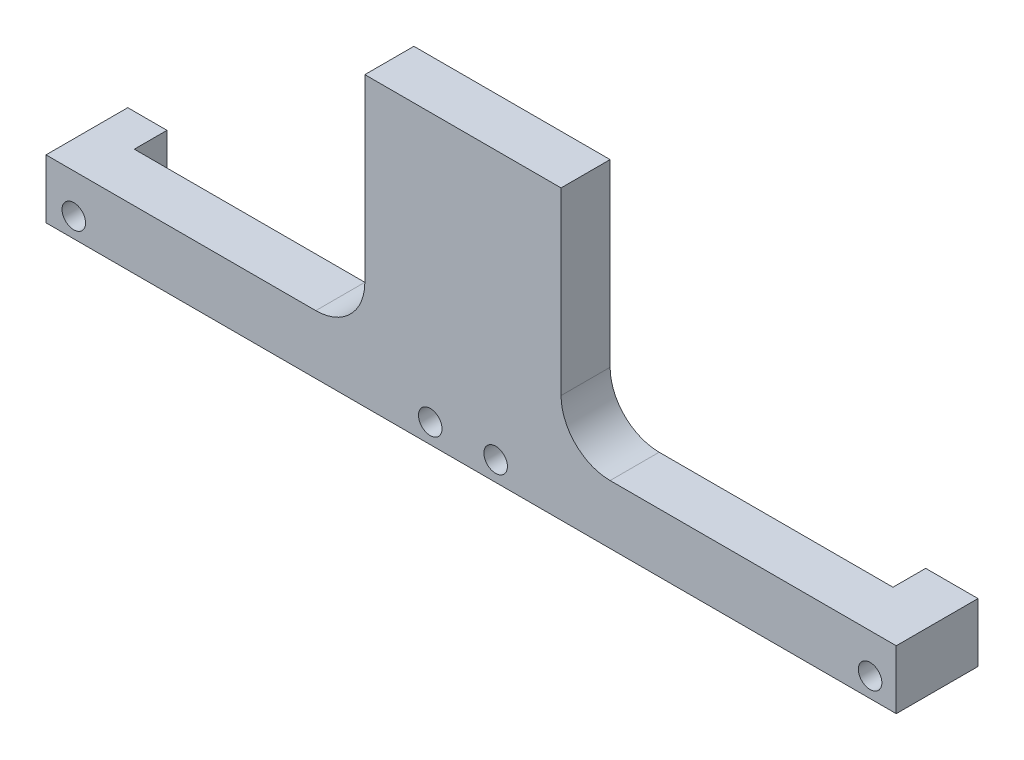
ISO-10303-21;
HEADER;
FILE_DESCRIPTION(('STEP AP214'),'2;1');
FILE_NAME('part.step','',(''),(''),'','','');
FILE_SCHEMA(('AUTOMOTIVE_DESIGN { 1 0 10303 214 1 1 1 1 }'));
ENDSEC;
DATA;
#1=APPLICATION_CONTEXT('core data for automotive mechanical design processes');
#2=APPLICATION_PROTOCOL_DEFINITION('international standard','automotive_design',2000,#1);
#3=PRODUCT_CONTEXT('',#1,'mechanical');
#4=PRODUCT('Part','Part','',(#3));
#5=PRODUCT_RELATED_PRODUCT_CATEGORY('part','',(#4));
#6=PRODUCT_DEFINITION_FORMATION('','',#4);
#7=PRODUCT_DEFINITION_CONTEXT('part definition',#1,'design');
#8=PRODUCT_DEFINITION('design','',#6,#7);
#9=PRODUCT_DEFINITION_SHAPE('','',#8);
#10=(LENGTH_UNIT() NAMED_UNIT(*) SI_UNIT(.MILLI.,.METRE.));
#11=(NAMED_UNIT(*) PLANE_ANGLE_UNIT() SI_UNIT($,.RADIAN.));
#12=(NAMED_UNIT(*) SI_UNIT($,.STERADIAN.) SOLID_ANGLE_UNIT());
#13=UNCERTAINTY_MEASURE_WITH_UNIT(LENGTH_MEASURE(1.E-05),#10,'distance_accuracy_value','');
#14=(GEOMETRIC_REPRESENTATION_CONTEXT(3) GLOBAL_UNCERTAINTY_ASSIGNED_CONTEXT((#13)) GLOBAL_UNIT_ASSIGNED_CONTEXT((#10,
#11,#12)) REPRESENTATION_CONTEXT('',''));
#15=CARTESIAN_POINT('',(0.,0.,0.));
#16=DIRECTION('',(0.,0.,1.));
#17=DIRECTION('',(1.,0.,0.));
#18=AXIS2_PLACEMENT_3D('',#15,#16,#17);
#19=CARTESIAN_POINT('',(0.,0.,0.));
#20=DIRECTION('',(0.,0.,-1.));
#21=DIRECTION('',(-1.,0.,0.));
#22=AXIS2_PLACEMENT_3D('',#19,#20,#21);
#23=PLANE('',#22);
#24=CARTESIAN_POINT('',(-125.75,3.,0.));
#25=DIRECTION('',(0.,0.,1.));
#26=DIRECTION('',(-1.,0.,0.));
#27=AXIS2_PLACEMENT_3D('',#24,#25,#26);
#28=CIRCLE('',#27,1.80000000000001);
#29=CARTESIAN_POINT('',(-124.,2.5786925113419,0.));
#30=VERTEX_POINT('',#29);
#31=CARTESIAN_POINT('',(-124.,3.42130748865815,0.));
#32=VERTEX_POINT('',#31);
#33=EDGE_CURVE('E174',#30,#32,#28,.T.);
#34=ORIENTED_EDGE('',*,*,#33,.T.);
#35=DIRECTION('',(0.,-1.,0.));
#36=VECTOR('',#35,1.);
#37=CARTESIAN_POINT('',(-124.,9.,0.));
#38=LINE('',#37,#36);
#39=CARTESIAN_POINT('',(-124.,9.,0.));
#40=VERTEX_POINT('',#39);
#41=EDGE_CURVE('E52',#40,#32,#38,.T.);
#42=ORIENTED_EDGE('',*,*,#41,.F.);
#43=DIRECTION('',(-1.,0.,0.));
#44=VECTOR('',#43,1.);
#45=CARTESIAN_POINT('',(-130.,9.,0.));
#46=LINE('',#45,#44);
#47=CARTESIAN_POINT('',(-88.75,9.,0.));
#48=VERTEX_POINT('',#47);
#49=EDGE_CURVE('E306',#48,#40,#46,.T.);
#50=ORIENTED_EDGE('',*,*,#49,.F.);
#51=CARTESIAN_POINT('',(-88.75,16.5,0.));
#52=DIRECTION('',(0.,0.,-1.));
#53=DIRECTION('',(-1.,0.,0.));
#54=AXIS2_PLACEMENT_3D('',#51,#52,#53);
#55=CIRCLE('',#54,7.5);
#56=CARTESIAN_POINT('',(-81.25,16.5,0.));
#57=VERTEX_POINT('',#56);
#58=EDGE_CURVE('E45',#48,#57,#55,.F.);
#59=ORIENTED_EDGE('',*,*,#58,.T.);
#60=DIRECTION('',(0.,-1.,0.));
#61=VECTOR('',#60,1.);
#62=CARTESIAN_POINT('',(-81.25,9.,0.));
#63=LINE('',#62,#61);
#64=CARTESIAN_POINT('',(-81.25,44.,0.));
#65=VERTEX_POINT('',#64);
#66=EDGE_CURVE('E303',#65,#57,#63,.T.);
#67=ORIENTED_EDGE('',*,*,#66,.F.);
#68=DIRECTION('',(-1.,0.,0.));
#69=VECTOR('',#68,1.);
#70=CARTESIAN_POINT('',(-81.25,44.,0.));
#71=LINE('',#70,#69);
#72=CARTESIAN_POINT('',(-51.25,44.,0.));
#73=VERTEX_POINT('',#72);
#74=EDGE_CURVE('E301',#73,#65,#71,.T.);
#75=ORIENTED_EDGE('',*,*,#74,.F.);
#76=DIRECTION('',(0.,1.,0.));
#77=VECTOR('',#76,1.);
#78=CARTESIAN_POINT('',(-51.25,44.,0.));
#79=LINE('',#78,#77);
#80=CARTESIAN_POINT('',(-51.25,16.5,0.));
#81=VERTEX_POINT('',#80);
#82=EDGE_CURVE('E299',#81,#73,#79,.T.);
#83=ORIENTED_EDGE('',*,*,#82,.F.);
#84=CARTESIAN_POINT('',(-43.75,16.5,0.));
#85=DIRECTION('',(0.,0.,-1.));
#86=DIRECTION('',(-1.,0.,0.));
#87=AXIS2_PLACEMENT_3D('',#84,#85,#86);
#88=CIRCLE('',#87,7.5);
#89=CARTESIAN_POINT('',(-43.75,8.99999999999999,0.));
#90=VERTEX_POINT('',#89);
#91=EDGE_CURVE('E333',#81,#90,#88,.F.);
#92=ORIENTED_EDGE('',*,*,#91,.T.);
#93=DIRECTION('',(-1.,0.,0.));
#94=VECTOR('',#93,1.);
#95=CARTESIAN_POINT('',(-51.25,8.99999999999999,0.));
#96=LINE('',#95,#94);
#97=CARTESIAN_POINT('',(-8.,8.99999999999999,0.));
#98=VERTEX_POINT('',#97);
#99=EDGE_CURVE('E277',#98,#90,#96,.T.);
#100=ORIENTED_EDGE('',*,*,#99,.F.);
#101=DIRECTION('',(0.,1.,0.));
#102=VECTOR('',#101,1.);
#103=CARTESIAN_POINT('',(-8.,0.,0.));
#104=LINE('',#103,#102);
#105=CARTESIAN_POINT('',(-8.,0.,0.));
#106=VERTEX_POINT('',#105);
#107=EDGE_CURVE('E249',#106,#98,#104,.T.);
#108=ORIENTED_EDGE('',*,*,#107,.F.);
#109=DIRECTION('',(1.,0.,0.));
#110=VECTOR('',#109,1.);
#111=CARTESIAN_POINT('',(0.,0.,0.));
#112=LINE('',#111,#110);
#113=CARTESIAN_POINT('',(-56.25,0.,0.));
#114=VERTEX_POINT('',#113);
#115=EDGE_CURVE('E308',#114,#106,#112,.T.);
#116=ORIENTED_EDGE('',*,*,#115,.F.);
#117=DIRECTION('',(0.,-1.,0.));
#118=VECTOR('',#117,1.);
#119=CARTESIAN_POINT('',(-56.25,0.,0.));
#120=LINE('',#119,#118);
#121=CARTESIAN_POINT('',(-56.25,6.,0.));
#122=VERTEX_POINT('',#121);
#123=EDGE_CURVE('E231',#122,#114,#120,.T.);
#124=ORIENTED_EDGE('',*,*,#123,.F.);
#125=DIRECTION('',(1.,0.,0.));
#126=VECTOR('',#125,1.);
#127=CARTESIAN_POINT('',(-56.25,6.,0.));
#128=LINE('',#127,#126);
#129=CARTESIAN_POINT('',(-76.25,6.,0.));
#130=VERTEX_POINT('',#129);
#131=EDGE_CURVE('E226',#130,#122,#128,.T.);
#132=ORIENTED_EDGE('',*,*,#131,.F.);
#133=DIRECTION('',(0.,1.,0.));
#134=VECTOR('',#133,1.);
#135=CARTESIAN_POINT('',(-76.25,0.,0.));
#136=LINE('',#135,#134);
#137=CARTESIAN_POINT('',(-76.25,0.,0.));
#138=VERTEX_POINT('',#137);
#139=EDGE_CURVE('E228',#138,#130,#136,.T.);
#140=ORIENTED_EDGE('',*,*,#139,.F.);
#141=CARTESIAN_POINT('',(-124.,0.,0.));
#142=VERTEX_POINT('',#141);
#143=EDGE_CURVE('E59',#142,#138,#112,.T.);
#144=ORIENTED_EDGE('',*,*,#143,.F.);
#145=DIRECTION('',(0.,-1.,0.));
#146=VECTOR('',#145,1.);
#147=CARTESIAN_POINT('',(-124.,0.,0.));
#148=LINE('',#147,#146);
#149=EDGE_CURVE('E185',#30,#142,#148,.T.);
#150=ORIENTED_EDGE('',*,*,#149,.F.);
#151=EDGE_LOOP('',(#34,#42,#50,#59,#67,#75,#83,#92,#100,#108,#116,#124,#132,#140,#144,#150));
#152=FACE_BOUND('',#151,.T.);
#153=ADVANCED_FACE('F37',(#152),#23,.T.);
#154=CARTESIAN_POINT('',(0.,0.,7.5));
#155=DIRECTION('',(0.,0.,-1.));
#156=DIRECTION('',(-1.,0.,0.));
#157=AXIS2_PLACEMENT_3D('',#154,#155,#156);
#158=PLANE('',#157);
#159=DIRECTION('',(-1.,0.,0.));
#160=VECTOR('',#159,1.);
#161=CARTESIAN_POINT('',(-51.25,8.99999999999999,7.5));
#162=LINE('',#161,#160);
#163=CARTESIAN_POINT('',(0.,8.99999999999999,7.5));
#164=VERTEX_POINT('',#163);
#165=CARTESIAN_POINT('',(-43.75,8.99999999999999,7.5));
#166=VERTEX_POINT('',#165);
#167=EDGE_CURVE('E279',#164,#166,#162,.T.);
#168=ORIENTED_EDGE('',*,*,#167,.T.);
#169=CARTESIAN_POINT('',(-43.75,16.5,7.5));
#170=DIRECTION('',(0.,0.,-1.));
#171=DIRECTION('',(-1.,0.,0.));
#172=AXIS2_PLACEMENT_3D('',#169,#170,#171);
#173=CIRCLE('',#172,7.5);
#174=CARTESIAN_POINT('',(-51.25,16.5,7.5));
#175=VERTEX_POINT('',#174);
#176=EDGE_CURVE('E336',#166,#175,#173,.T.);
#177=ORIENTED_EDGE('',*,*,#176,.T.);
#178=DIRECTION('',(0.,1.,0.));
#179=VECTOR('',#178,1.);
#180=CARTESIAN_POINT('',(-51.25,44.,7.5));
#181=LINE('',#180,#179);
#182=CARTESIAN_POINT('',(-51.25,44.,7.5));
#183=VERTEX_POINT('',#182);
#184=EDGE_CURVE('E282',#175,#183,#181,.T.);
#185=ORIENTED_EDGE('',*,*,#184,.T.);
#186=DIRECTION('',(-1.,0.,0.));
#187=VECTOR('',#186,1.);
#188=CARTESIAN_POINT('',(-81.25,44.,7.5));
#189=LINE('',#188,#187);
#190=CARTESIAN_POINT('',(-81.25,44.,7.5));
#191=VERTEX_POINT('',#190);
#192=EDGE_CURVE('E284',#183,#191,#189,.T.);
#193=ORIENTED_EDGE('',*,*,#192,.T.);
#194=DIRECTION('',(0.,-1.,0.));
#195=VECTOR('',#194,1.);
#196=CARTESIAN_POINT('',(-81.25,9.,7.5));
#197=LINE('',#196,#195);
#198=CARTESIAN_POINT('',(-81.25,16.5,7.5));
#199=VERTEX_POINT('',#198);
#200=EDGE_CURVE('E286',#191,#199,#197,.T.);
#201=ORIENTED_EDGE('',*,*,#200,.T.);
#202=CARTESIAN_POINT('',(-88.75,16.5,7.5));
#203=DIRECTION('',(0.,0.,-1.));
#204=DIRECTION('',(-1.,0.,0.));
#205=AXIS2_PLACEMENT_3D('',#202,#203,#204);
#206=CIRCLE('',#205,7.5);
#207=CARTESIAN_POINT('',(-88.75,9.,7.5));
#208=VERTEX_POINT('',#207);
#209=EDGE_CURVE('E11',#199,#208,#206,.T.);
#210=ORIENTED_EDGE('',*,*,#209,.T.);
#211=DIRECTION('',(-1.,0.,0.));
#212=VECTOR('',#211,1.);
#213=CARTESIAN_POINT('',(-130.,9.,7.5));
#214=LINE('',#213,#212);
#215=CARTESIAN_POINT('',(-130.,9.,7.5));
#216=VERTEX_POINT('',#215);
#217=EDGE_CURVE('E289',#208,#216,#214,.T.);
#218=ORIENTED_EDGE('',*,*,#217,.T.);
#219=DIRECTION('',(0.,-1.,0.));
#220=VECTOR('',#219,1.);
#221=CARTESIAN_POINT('',(-130.,0.,7.5));
#222=LINE('',#221,#220);
#223=CARTESIAN_POINT('',(-130.,0.,7.5));
#224=VERTEX_POINT('',#223);
#225=EDGE_CURVE('E291',#216,#224,#222,.T.);
#226=ORIENTED_EDGE('',*,*,#225,.T.);
#227=DIRECTION('',(1.,0.,0.));
#228=VECTOR('',#227,1.);
#229=CARTESIAN_POINT('',(0.,0.,7.5));
#230=LINE('',#229,#228);
#231=CARTESIAN_POINT('',(0.,0.,7.5));
#232=VERTEX_POINT('',#231);
#233=EDGE_CURVE('E293',#224,#232,#230,.T.);
#234=ORIENTED_EDGE('',*,*,#233,.T.);
#235=DIRECTION('',(0.,1.,0.));
#236=VECTOR('',#235,1.);
#237=CARTESIAN_POINT('',(0.,8.99999999999999,7.5));
#238=LINE('',#237,#236);
#239=EDGE_CURVE('E295',#232,#164,#238,.T.);
#240=ORIENTED_EDGE('',*,*,#239,.T.);
#241=EDGE_LOOP('',(#168,#177,#185,#193,#201,#210,#218,#226,#234,#240));
#242=FACE_BOUND('',#241,.T.);
#243=CARTESIAN_POINT('',(-125.75,3.,7.5));
#244=DIRECTION('',(0.,0.,1.));
#245=DIRECTION('',(-1.,0.,0.));
#246=AXIS2_PLACEMENT_3D('',#243,#244,#245);
#247=CIRCLE('',#246,1.80000000000001);
#248=CARTESIAN_POINT('',(-127.55,3.,7.5));
#249=VERTEX_POINT('',#248);
#250=EDGE_CURVE('E182',#249,#249,#247,.T.);
#251=ORIENTED_EDGE('',*,*,#250,.F.);
#252=EDGE_LOOP('',(#251));
#253=FACE_BOUND('',#252,.T.);
#254=CARTESIAN_POINT('',(-71.25,3.,7.5));
#255=DIRECTION('',(0.,0.,1.));
#256=DIRECTION('',(-1.,0.,0.));
#257=AXIS2_PLACEMENT_3D('',#254,#255,#256);
#258=CIRCLE('',#257,1.79999999999999);
#259=CARTESIAN_POINT('',(-73.05,3.,7.5));
#260=VERTEX_POINT('',#259);
#261=EDGE_CURVE('E183',#260,#260,#258,.T.);
#262=ORIENTED_EDGE('',*,*,#261,.F.);
#263=EDGE_LOOP('',(#262));
#264=FACE_BOUND('',#263,.T.);
#265=CARTESIAN_POINT('',(-61.25,3.,7.5));
#266=DIRECTION('',(0.,0.,1.));
#267=DIRECTION('',(-1.,0.,0.));
#268=AXIS2_PLACEMENT_3D('',#265,#266,#267);
#269=CIRCLE('',#268,1.79999999999999);
#270=CARTESIAN_POINT('',(-63.05,3.,7.5));
#271=VERTEX_POINT('',#270);
#272=EDGE_CURVE('E271',#271,#271,#269,.T.);
#273=ORIENTED_EDGE('',*,*,#272,.F.);
#274=EDGE_LOOP('',(#273));
#275=FACE_BOUND('',#274,.T.);
#276=CARTESIAN_POINT('',(-4.,3.,7.5));
#277=DIRECTION('',(0.,0.,1.));
#278=DIRECTION('',(-1.,0.,0.));
#279=AXIS2_PLACEMENT_3D('',#276,#277,#278);
#280=CIRCLE('',#279,1.8);
#281=CARTESIAN_POINT('',(-5.8,3.,7.5));
#282=VERTEX_POINT('',#281);
#283=EDGE_CURVE('E268',#282,#282,#280,.T.);
#284=ORIENTED_EDGE('',*,*,#283,.F.);
#285=EDGE_LOOP('',(#284));
#286=FACE_BOUND('',#285,.T.);
#287=ADVANCED_FACE('F349',(#242,#253,#264,#275,#286),#158,.F.);
#288=CARTESIAN_POINT('',(-51.25,8.99999999999999,7.5));
#289=DIRECTION('',(0.,-1.,0.));
#290=DIRECTION('',(0.,0.,-1.));
#291=AXIS2_PLACEMENT_3D('',#288,#289,#290);
#292=PLANE('',#291);
#293=DIRECTION('',(0.,0.,-1.));
#294=VECTOR('',#293,1.);
#295=CARTESIAN_POINT('',(0.,8.99999999999999,7.5));
#296=LINE('',#295,#294);
#297=CARTESIAN_POINT('',(0.,8.99999999999999,-5.));
#298=VERTEX_POINT('',#297);
#299=EDGE_CURVE('E297',#164,#298,#296,.T.);
#300=ORIENTED_EDGE('',*,*,#299,.T.);
#301=DIRECTION('',(1.,0.,0.));
#302=VECTOR('',#301,1.);
#303=CARTESIAN_POINT('',(0.,8.99999999999999,-5.));
#304=LINE('',#303,#302);
#305=CARTESIAN_POINT('',(-8.,8.99999999999999,-5.));
#306=VERTEX_POINT('',#305);
#307=EDGE_CURVE('E257',#306,#298,#304,.T.);
#308=ORIENTED_EDGE('',*,*,#307,.F.);
#309=DIRECTION('',(0.,0.,1.));
#310=VECTOR('',#309,1.);
#311=CARTESIAN_POINT('',(-8.,8.99999999999999,-5.));
#312=LINE('',#311,#310);
#313=EDGE_CURVE('E260',#306,#98,#312,.T.);
#314=ORIENTED_EDGE('',*,*,#313,.T.);
#315=ORIENTED_EDGE('',*,*,#99,.T.);
#316=DIRECTION('',(0.,0.,-1.));
#317=VECTOR('',#316,1.);
#318=CARTESIAN_POINT('',(-43.75,8.99999999999999,7.5));
#319=LINE('',#318,#317);
#320=EDGE_CURVE('E326',#90,#166,#319,.F.);
#321=ORIENTED_EDGE('',*,*,#320,.T.);
#322=ORIENTED_EDGE('',*,*,#167,.F.);
#323=EDGE_LOOP('',(#300,#308,#314,#315,#321,#322));
#324=FACE_BOUND('',#323,.T.);
#325=ADVANCED_FACE('F375',(#324),#292,.F.);
#326=CARTESIAN_POINT('',(-51.25,44.,7.5));
#327=DIRECTION('',(-1.,0.,0.));
#328=DIRECTION('',(0.,0.,1.));
#329=AXIS2_PLACEMENT_3D('',#326,#327,#328);
#330=PLANE('',#329);
#331=ORIENTED_EDGE('',*,*,#184,.F.);
#332=DIRECTION('',(0.,0.,-1.));
#333=VECTOR('',#332,1.);
#334=CARTESIAN_POINT('',(-51.25,16.5,0.));
#335=LINE('',#334,#333);
#336=EDGE_CURVE('E323',#175,#81,#335,.T.);
#337=ORIENTED_EDGE('',*,*,#336,.T.);
#338=ORIENTED_EDGE('',*,*,#82,.T.);
#339=DIRECTION('',(0.,0.,-1.));
#340=VECTOR('',#339,1.);
#341=CARTESIAN_POINT('',(-51.25,44.,7.5));
#342=LINE('',#341,#340);
#343=EDGE_CURVE('E320',#183,#73,#342,.T.);
#344=ORIENTED_EDGE('',*,*,#343,.F.);
#345=EDGE_LOOP('',(#331,#337,#338,#344));
#346=FACE_BOUND('',#345,.T.);
#347=ADVANCED_FACE('F384',(#346),#330,.F.);
#348=CARTESIAN_POINT('',(-81.25,44.,7.5));
#349=DIRECTION('',(0.,-1.,0.));
#350=DIRECTION('',(0.,0.,-1.));
#351=AXIS2_PLACEMENT_3D('',#348,#349,#350);
#352=PLANE('',#351);
#353=ORIENTED_EDGE('',*,*,#74,.T.);
#354=DIRECTION('',(0.,0.,-1.));
#355=VECTOR('',#354,1.);
#356=CARTESIAN_POINT('',(-81.25,44.,7.5));
#357=LINE('',#356,#355);
#358=EDGE_CURVE('E317',#191,#65,#357,.T.);
#359=ORIENTED_EDGE('',*,*,#358,.F.);
#360=ORIENTED_EDGE('',*,*,#192,.F.);
#361=ORIENTED_EDGE('',*,*,#343,.T.);
#362=EDGE_LOOP('',(#353,#359,#360,#361));
#363=FACE_BOUND('',#362,.T.);
#364=ADVANCED_FACE('F387',(#363),#352,.F.);
#365=CARTESIAN_POINT('',(-81.25,9.,7.5));
#366=DIRECTION('',(1.,0.,0.));
#367=DIRECTION('',(0.,0.,-1.));
#368=AXIS2_PLACEMENT_3D('',#365,#366,#367);
#369=PLANE('',#368);
#370=ORIENTED_EDGE('',*,*,#66,.T.);
#371=DIRECTION('',(0.,0.,-1.));
#372=VECTOR('',#371,1.);
#373=CARTESIAN_POINT('',(-81.25,16.5,7.5));
#374=LINE('',#373,#372);
#375=EDGE_CURVE('E331',#57,#199,#374,.F.);
#376=ORIENTED_EDGE('',*,*,#375,.T.);
#377=ORIENTED_EDGE('',*,*,#200,.F.);
#378=ORIENTED_EDGE('',*,*,#358,.T.);
#379=EDGE_LOOP('',(#370,#376,#377,#378));
#380=FACE_BOUND('',#379,.T.);
#381=ADVANCED_FACE('F343',(#380),#369,.F.);
#382=CARTESIAN_POINT('',(-130.,9.,7.5));
#383=DIRECTION('',(0.,-1.,0.));
#384=DIRECTION('',(0.,0.,-1.));
#385=AXIS2_PLACEMENT_3D('',#382,#383,#384);
#386=PLANE('',#385);
#387=ORIENTED_EDGE('',*,*,#217,.F.);
#388=DIRECTION('',(0.,0.,-1.));
#389=VECTOR('',#388,1.);
#390=CARTESIAN_POINT('',(-88.75,9.,0.));
#391=LINE('',#390,#389);
#392=EDGE_CURVE('E328',#208,#48,#391,.T.);
#393=ORIENTED_EDGE('',*,*,#392,.T.);
#394=ORIENTED_EDGE('',*,*,#49,.T.);
#395=DIRECTION('',(0.,0.,1.));
#396=VECTOR('',#395,1.);
#397=CARTESIAN_POINT('',(-124.,9.,-5.));
#398=LINE('',#397,#396);
#399=CARTESIAN_POINT('',(-124.,9.,-5.));
#400=VERTEX_POINT('',#399);
#401=EDGE_CURVE('E197',#400,#40,#398,.T.);
#402=ORIENTED_EDGE('',*,*,#401,.F.);
#403=DIRECTION('',(1.,0.,0.));
#404=VECTOR('',#403,1.);
#405=CARTESIAN_POINT('',(-130.,9.,-5.));
#406=LINE('',#405,#404);
#407=CARTESIAN_POINT('',(-130.,9.,-5.));
#408=VERTEX_POINT('',#407);
#409=EDGE_CURVE('E210',#408,#400,#406,.T.);
#410=ORIENTED_EDGE('',*,*,#409,.F.);
#411=DIRECTION('',(0.,0.,-1.));
#412=VECTOR('',#411,1.);
#413=CARTESIAN_POINT('',(-130.,9.,7.5));
#414=LINE('',#413,#412);
#415=EDGE_CURVE('E315',#216,#408,#414,.T.);
#416=ORIENTED_EDGE('',*,*,#415,.F.);
#417=EDGE_LOOP('',(#387,#393,#394,#402,#410,#416));
#418=FACE_BOUND('',#417,.T.);
#419=ADVANCED_FACE('F353',(#418),#386,.F.);
#420=CARTESIAN_POINT('',(-130.,0.,7.5));
#421=DIRECTION('',(1.,0.,0.));
#422=DIRECTION('',(0.,0.,-1.));
#423=AXIS2_PLACEMENT_3D('',#420,#421,#422);
#424=PLANE('',#423);
#425=ORIENTED_EDGE('',*,*,#415,.T.);
#426=DIRECTION('',(0.,1.,0.));
#427=VECTOR('',#426,1.);
#428=CARTESIAN_POINT('',(-130.,0.,-5.));
#429=LINE('',#428,#427);
#430=CARTESIAN_POINT('',(-130.,0.,-5.));
#431=VERTEX_POINT('',#430);
#432=EDGE_CURVE('E189',#431,#408,#429,.T.);
#433=ORIENTED_EDGE('',*,*,#432,.F.);
#434=DIRECTION('',(0.,0.,-1.));
#435=VECTOR('',#434,1.);
#436=CARTESIAN_POINT('',(-130.,0.,7.5));
#437=LINE('',#436,#435);
#438=EDGE_CURVE('E313',#224,#431,#437,.T.);
#439=ORIENTED_EDGE('',*,*,#438,.F.);
#440=ORIENTED_EDGE('',*,*,#225,.F.);
#441=EDGE_LOOP('',(#425,#433,#439,#440));
#442=FACE_BOUND('',#441,.T.);
#443=ADVANCED_FACE('F360',(#442),#424,.F.);
#444=CARTESIAN_POINT('',(0.,0.,7.5));
#445=DIRECTION('',(0.,1.,0.));
#446=DIRECTION('',(0.,0.,1.));
#447=AXIS2_PLACEMENT_3D('',#444,#445,#446);
#448=PLANE('',#447);
#449=ORIENTED_EDGE('',*,*,#438,.T.);
#450=DIRECTION('',(-1.,0.,0.));
#451=VECTOR('',#450,1.);
#452=CARTESIAN_POINT('',(-130.,0.,-5.));
#453=LINE('',#452,#451);
#454=CARTESIAN_POINT('',(-124.,0.,-5.));
#455=VERTEX_POINT('',#454);
#456=EDGE_CURVE('E195',#455,#431,#453,.T.);
#457=ORIENTED_EDGE('',*,*,#456,.F.);
#458=DIRECTION('',(0.,0.,1.));
#459=VECTOR('',#458,1.);
#460=CARTESIAN_POINT('',(-124.,0.,-5.));
#461=LINE('',#460,#459);
#462=EDGE_CURVE('E193',#455,#142,#461,.T.);
#463=ORIENTED_EDGE('',*,*,#462,.T.);
#464=ORIENTED_EDGE('',*,*,#143,.T.);
#465=DIRECTION('',(0.,0.,1.));
#466=VECTOR('',#465,1.);
#467=CARTESIAN_POINT('',(-76.25,0.,-5.));
#468=LINE('',#467,#466);
#469=CARTESIAN_POINT('',(-76.25,0.,-5.));
#470=VERTEX_POINT('',#469);
#471=EDGE_CURVE('E216',#470,#138,#468,.T.);
#472=ORIENTED_EDGE('',*,*,#471,.F.);
#473=DIRECTION('',(-1.,0.,0.));
#474=VECTOR('',#473,1.);
#475=CARTESIAN_POINT('',(-56.25,0.,-5.));
#476=LINE('',#475,#474);
#477=CARTESIAN_POINT('',(-56.25,0.,-5.));
#478=VERTEX_POINT('',#477);
#479=EDGE_CURVE('E237',#478,#470,#476,.T.);
#480=ORIENTED_EDGE('',*,*,#479,.F.);
#481=DIRECTION('',(0.,0.,1.));
#482=VECTOR('',#481,1.);
#483=CARTESIAN_POINT('',(-56.25,0.,-5.));
#484=LINE('',#483,#482);
#485=EDGE_CURVE('E202',#478,#114,#484,.T.);
#486=ORIENTED_EDGE('',*,*,#485,.T.);
#487=ORIENTED_EDGE('',*,*,#115,.T.);
#488=DIRECTION('',(0.,0.,1.));
#489=VECTOR('',#488,1.);
#490=CARTESIAN_POINT('',(-8.,0.,-5.));
#491=LINE('',#490,#489);
#492=CARTESIAN_POINT('',(-8.,0.,-5.));
#493=VERTEX_POINT('',#492);
#494=EDGE_CURVE('E265',#493,#106,#491,.T.);
#495=ORIENTED_EDGE('',*,*,#494,.F.);
#496=DIRECTION('',(-1.,0.,0.));
#497=VECTOR('',#496,1.);
#498=CARTESIAN_POINT('',(0.,0.,-5.));
#499=LINE('',#498,#497);
#500=CARTESIAN_POINT('',(0.,0.,-5.));
#501=VERTEX_POINT('',#500);
#502=EDGE_CURVE('E253',#501,#493,#499,.T.);
#503=ORIENTED_EDGE('',*,*,#502,.F.);
#504=DIRECTION('',(0.,0.,-1.));
#505=VECTOR('',#504,1.);
#506=CARTESIAN_POINT('',(0.,0.,7.5));
#507=LINE('',#506,#505);
#508=EDGE_CURVE('E311',#232,#501,#507,.T.);
#509=ORIENTED_EDGE('',*,*,#508,.F.);
#510=ORIENTED_EDGE('',*,*,#233,.F.);
#511=EDGE_LOOP('',(#449,#457,#463,#464,#472,#480,#486,#487,#495,#503,#509,#510));
#512=FACE_BOUND('',#511,.T.);
#513=ADVANCED_FACE('F367',(#512),#448,.F.);
#514=CARTESIAN_POINT('',(0.,8.99999999999999,7.5));
#515=DIRECTION('',(-1.,0.,0.));
#516=DIRECTION('',(0.,0.,1.));
#517=AXIS2_PLACEMENT_3D('',#514,#515,#516);
#518=PLANE('',#517);
#519=ORIENTED_EDGE('',*,*,#508,.T.);
#520=DIRECTION('',(0.,-1.,0.));
#521=VECTOR('',#520,1.);
#522=CARTESIAN_POINT('',(0.,0.,-5.));
#523=LINE('',#522,#521);
#524=EDGE_CURVE('E250',#298,#501,#523,.T.);
#525=ORIENTED_EDGE('',*,*,#524,.F.);
#526=ORIENTED_EDGE('',*,*,#299,.F.);
#527=ORIENTED_EDGE('',*,*,#239,.F.);
#528=EDGE_LOOP('',(#519,#525,#526,#527));
#529=FACE_BOUND('',#528,.T.);
#530=ADVANCED_FACE('F371',(#529),#518,.F.);
#531=CARTESIAN_POINT('',(-125.75,3.,7.5));
#532=DIRECTION('',(0.,0.,-1.));
#533=DIRECTION('',(-1.,0.,0.));
#534=AXIS2_PLACEMENT_3D('',#531,#532,#533);
#535=CYLINDRICAL_SURFACE('',#534,1.80000000000001);
#536=ORIENTED_EDGE('',*,*,#250,.T.);
#537=EDGE_LOOP('',(#536));
#538=FACE_BOUND('',#537,.T.);
#539=ORIENTED_EDGE('',*,*,#33,.F.);
#540=DIRECTION('',(0.,0.,1.));
#541=VECTOR('',#540,1.);
#542=CARTESIAN_POINT('',(-124.,2.5786925113419,-5.));
#543=LINE('',#542,#541);
#544=CARTESIAN_POINT('',(-124.,2.5786925113419,-5.));
#545=VERTEX_POINT('',#544);
#546=EDGE_CURVE('E178',#545,#30,#543,.T.);
#547=ORIENTED_EDGE('',*,*,#546,.F.);
#548=CARTESIAN_POINT('',(-125.75,3.,-5.));
#549=DIRECTION('',(0.,0.,1.));
#550=DIRECTION('',(-1.,0.,0.));
#551=AXIS2_PLACEMENT_3D('',#548,#549,#550);
#552=CIRCLE('',#551,1.8);
#553=CARTESIAN_POINT('',(-124.,3.42130748865814,-5.));
#554=VERTEX_POINT('',#553);
#555=EDGE_CURVE('E206',#554,#545,#552,.T.);
#556=ORIENTED_EDGE('',*,*,#555,.F.);
#557=DIRECTION('',(0.,0.,1.));
#558=VECTOR('',#557,1.);
#559=CARTESIAN_POINT('',(-124.,3.42130748865814,-5.));
#560=LINE('',#559,#558);
#561=EDGE_CURVE('E181',#554,#32,#560,.T.);
#562=ORIENTED_EDGE('',*,*,#561,.T.);
#563=EDGE_LOOP('',(#539,#547,#556,#562));
#564=FACE_BOUND('',#563,.T.);
#565=ADVANCED_FACE('F175',(#538,#564),#535,.F.);
#566=CARTESIAN_POINT('',(-71.25,3.,7.5));
#567=DIRECTION('',(0.,0.,-1.));
#568=DIRECTION('',(-1.,0.,0.));
#569=AXIS2_PLACEMENT_3D('',#566,#567,#568);
#570=CYLINDRICAL_SURFACE('',#569,1.79999999999999);
#571=ORIENTED_EDGE('',*,*,#261,.T.);
#572=EDGE_LOOP('',(#571));
#573=FACE_BOUND('',#572,.T.);
#574=CARTESIAN_POINT('',(-71.25,3.,-5.));
#575=DIRECTION('',(0.,0.,-1.));
#576=DIRECTION('',(-1.,0.,0.));
#577=AXIS2_PLACEMENT_3D('',#574,#575,#576);
#578=CIRCLE('',#577,1.79999999999999);
#579=CARTESIAN_POINT('',(-73.05,3.,-5.));
#580=VERTEX_POINT('',#579);
#581=EDGE_CURVE('E243',#580,#580,#578,.T.);
#582=ORIENTED_EDGE('',*,*,#581,.T.);
#583=EDGE_LOOP('',(#582));
#584=FACE_BOUND('',#583,.T.);
#585=ADVANCED_FACE('F435',(#573,#584),#570,.F.);
#586=CARTESIAN_POINT('',(-61.25,3.,7.5));
#587=DIRECTION('',(0.,0.,-1.));
#588=DIRECTION('',(-1.,0.,0.));
#589=AXIS2_PLACEMENT_3D('',#586,#587,#588);
#590=CYLINDRICAL_SURFACE('',#589,1.79999999999999);
#591=ORIENTED_EDGE('',*,*,#272,.T.);
#592=EDGE_LOOP('',(#591));
#593=FACE_BOUND('',#592,.T.);
#594=CARTESIAN_POINT('',(-61.25,3.,-5.));
#595=DIRECTION('',(0.,0.,-1.));
#596=DIRECTION('',(-1.,0.,0.));
#597=AXIS2_PLACEMENT_3D('',#594,#595,#596);
#598=CIRCLE('',#597,1.79999999999999);
#599=CARTESIAN_POINT('',(-63.05,3.,-5.));
#600=VERTEX_POINT('',#599);
#601=EDGE_CURVE('E233',#600,#600,#598,.T.);
#602=ORIENTED_EDGE('',*,*,#601,.T.);
#603=EDGE_LOOP('',(#602));
#604=FACE_BOUND('',#603,.T.);
#605=ADVANCED_FACE('F442',(#593,#604),#590,.F.);
#606=CARTESIAN_POINT('',(-4.,3.,7.5));
#607=DIRECTION('',(0.,0.,-1.));
#608=DIRECTION('',(-1.,0.,0.));
#609=AXIS2_PLACEMENT_3D('',#606,#607,#608);
#610=CYLINDRICAL_SURFACE('',#609,1.8);
#611=ORIENTED_EDGE('',*,*,#283,.T.);
#612=EDGE_LOOP('',(#611));
#613=FACE_BOUND('',#612,.T.);
#614=CARTESIAN_POINT('',(-4.,3.,-5.));
#615=DIRECTION('',(0.,0.,-1.));
#616=DIRECTION('',(-1.,0.,0.));
#617=AXIS2_PLACEMENT_3D('',#614,#615,#616);
#618=CIRCLE('',#617,1.8);
#619=CARTESIAN_POINT('',(-5.8,3.,-5.));
#620=VERTEX_POINT('',#619);
#621=EDGE_CURVE('E246',#620,#620,#618,.T.);
#622=ORIENTED_EDGE('',*,*,#621,.T.);
#623=EDGE_LOOP('',(#622));
#624=FACE_BOUND('',#623,.T.);
#625=ADVANCED_FACE('F450',(#613,#624),#610,.F.);
#626=CARTESIAN_POINT('',(-43.75,16.5,7.5));
#627=DIRECTION('',(0.,0.,1.));
#628=DIRECTION('',(1.,0.,0.));
#629=AXIS2_PLACEMENT_3D('',#626,#627,#628);
#630=CYLINDRICAL_SURFACE('',#629,7.5);
#631=ORIENTED_EDGE('',*,*,#176,.F.);
#632=ORIENTED_EDGE('',*,*,#320,.F.);
#633=ORIENTED_EDGE('',*,*,#91,.F.);
#634=ORIENTED_EDGE('',*,*,#336,.F.);
#635=EDGE_LOOP('',(#631,#632,#633,#634));
#636=FACE_BOUND('',#635,.T.);
#637=ADVANCED_FACE('F381',(#636),#630,.F.);
#638=CARTESIAN_POINT('',(-88.75,16.5,7.5));
#639=DIRECTION('',(0.,0.,1.));
#640=DIRECTION('',(1.,0.,0.));
#641=AXIS2_PLACEMENT_3D('',#638,#639,#640);
#642=CYLINDRICAL_SURFACE('',#641,7.5);
#643=ORIENTED_EDGE('',*,*,#209,.F.);
#644=ORIENTED_EDGE('',*,*,#375,.F.);
#645=ORIENTED_EDGE('',*,*,#58,.F.);
#646=ORIENTED_EDGE('',*,*,#392,.F.);
#647=EDGE_LOOP('',(#643,#644,#645,#646));
#648=FACE_BOUND('',#647,.T.);
#649=ADVANCED_FACE('F39',(#648),#642,.F.);
#650=CARTESIAN_POINT('',(0.,0.,-5.));
#651=DIRECTION('',(0.,0.,1.));
#652=DIRECTION('',(1.,0.,0.));
#653=AXIS2_PLACEMENT_3D('',#650,#651,#652);
#654=PLANE('',#653);
#655=ORIENTED_EDGE('',*,*,#524,.T.);
#656=ORIENTED_EDGE('',*,*,#502,.T.);
#657=DIRECTION('',(0.,1.,0.));
#658=VECTOR('',#657,1.);
#659=CARTESIAN_POINT('',(-8.,0.,-5.));
#660=LINE('',#659,#658);
#661=EDGE_CURVE('E255',#493,#306,#660,.T.);
#662=ORIENTED_EDGE('',*,*,#661,.T.);
#663=ORIENTED_EDGE('',*,*,#307,.T.);
#664=EDGE_LOOP('',(#655,#656,#662,#663));
#665=FACE_BOUND('',#664,.T.);
#666=ORIENTED_EDGE('',*,*,#621,.F.);
#667=EDGE_LOOP('',(#666));
#668=FACE_BOUND('',#667,.T.);
#669=ADVANCED_FACE('F471',(#665,#668),#654,.F.);
#670=CARTESIAN_POINT('',(-8.,0.,-5.));
#671=DIRECTION('',(1.,0.,0.));
#672=DIRECTION('',(0.,0.,-1.));
#673=AXIS2_PLACEMENT_3D('',#670,#671,#672);
#674=PLANE('',#673);
#675=ORIENTED_EDGE('',*,*,#107,.T.);
#676=ORIENTED_EDGE('',*,*,#313,.F.);
#677=ORIENTED_EDGE('',*,*,#661,.F.);
#678=ORIENTED_EDGE('',*,*,#494,.T.);
#679=EDGE_LOOP('',(#675,#676,#677,#678));
#680=FACE_BOUND('',#679,.T.);
#681=ADVANCED_FACE('F476',(#680),#674,.F.);
#682=CARTESIAN_POINT('',(0.,0.,-5.));
#683=DIRECTION('',(0.,0.,1.));
#684=DIRECTION('',(1.,0.,0.));
#685=AXIS2_PLACEMENT_3D('',#682,#683,#684);
#686=PLANE('',#685);
#687=DIRECTION('',(0.,-1.,0.));
#688=VECTOR('',#687,1.);
#689=CARTESIAN_POINT('',(-56.25,0.,-5.));
#690=LINE('',#689,#688);
#691=CARTESIAN_POINT('',(-56.25,6.,-5.));
#692=VERTEX_POINT('',#691);
#693=EDGE_CURVE('E229',#692,#478,#690,.T.);
#694=ORIENTED_EDGE('',*,*,#693,.T.);
#695=ORIENTED_EDGE('',*,*,#479,.T.);
#696=DIRECTION('',(0.,1.,0.));
#697=VECTOR('',#696,1.);
#698=CARTESIAN_POINT('',(-76.25,0.,-5.));
#699=LINE('',#698,#697);
#700=CARTESIAN_POINT('',(-76.25,6.,-5.));
#701=VERTEX_POINT('',#700);
#702=EDGE_CURVE('E235',#470,#701,#699,.T.);
#703=ORIENTED_EDGE('',*,*,#702,.T.);
#704=DIRECTION('',(1.,0.,0.));
#705=VECTOR('',#704,1.);
#706=CARTESIAN_POINT('',(-56.25,6.,-5.));
#707=LINE('',#706,#705);
#708=EDGE_CURVE('E225',#701,#692,#707,.T.);
#709=ORIENTED_EDGE('',*,*,#708,.T.);
#710=EDGE_LOOP('',(#694,#695,#703,#709));
#711=FACE_BOUND('',#710,.T.);
#712=ORIENTED_EDGE('',*,*,#601,.F.);
#713=EDGE_LOOP('',(#712));
#714=FACE_BOUND('',#713,.T.);
#715=ORIENTED_EDGE('',*,*,#581,.F.);
#716=EDGE_LOOP('',(#715));
#717=FACE_BOUND('',#716,.T.);
#718=ADVANCED_FACE('F484',(#711,#714,#717),#686,.F.);
#719=CARTESIAN_POINT('',(-56.25,0.,-5.));
#720=DIRECTION('',(-1.,0.,0.));
#721=DIRECTION('',(0.,-1.,0.));
#722=AXIS2_PLACEMENT_3D('',#719,#720,#721);
#723=PLANE('',#722);
#724=ORIENTED_EDGE('',*,*,#123,.T.);
#725=ORIENTED_EDGE('',*,*,#485,.F.);
#726=ORIENTED_EDGE('',*,*,#693,.F.);
#727=DIRECTION('',(0.,0.,1.));
#728=VECTOR('',#727,1.);
#729=CARTESIAN_POINT('',(-56.25,6.,-5.));
#730=LINE('',#729,#728);
#731=EDGE_CURVE('E222',#692,#122,#730,.T.);
#732=ORIENTED_EDGE('',*,*,#731,.T.);
#733=EDGE_LOOP('',(#724,#725,#726,#732));
#734=FACE_BOUND('',#733,.T.);
#735=ADVANCED_FACE('F492',(#734),#723,.F.);
#736=CARTESIAN_POINT('',(-76.25,0.,-5.));
#737=DIRECTION('',(1.,0.,0.));
#738=DIRECTION('',(0.,0.,-1.));
#739=AXIS2_PLACEMENT_3D('',#736,#737,#738);
#740=PLANE('',#739);
#741=ORIENTED_EDGE('',*,*,#139,.T.);
#742=DIRECTION('',(0.,0.,1.));
#743=VECTOR('',#742,1.);
#744=CARTESIAN_POINT('',(-76.25,6.,-5.));
#745=LINE('',#744,#743);
#746=EDGE_CURVE('E219',#701,#130,#745,.T.);
#747=ORIENTED_EDGE('',*,*,#746,.F.);
#748=ORIENTED_EDGE('',*,*,#702,.F.);
#749=ORIENTED_EDGE('',*,*,#471,.T.);
#750=EDGE_LOOP('',(#741,#747,#748,#749));
#751=FACE_BOUND('',#750,.T.);
#752=ADVANCED_FACE('F500',(#751),#740,.F.);
#753=CARTESIAN_POINT('',(-56.25,6.,-5.));
#754=DIRECTION('',(0.,-1.,0.));
#755=DIRECTION('',(0.,0.,-1.));
#756=AXIS2_PLACEMENT_3D('',#753,#754,#755);
#757=PLANE('',#756);
#758=ORIENTED_EDGE('',*,*,#131,.T.);
#759=ORIENTED_EDGE('',*,*,#731,.F.);
#760=ORIENTED_EDGE('',*,*,#708,.F.);
#761=ORIENTED_EDGE('',*,*,#746,.T.);
#762=EDGE_LOOP('',(#758,#759,#760,#761));
#763=FACE_BOUND('',#762,.T.);
#764=ADVANCED_FACE('F508',(#763),#757,.F.);
#765=CARTESIAN_POINT('',(-124.,9.,-5.));
#766=DIRECTION('',(-1.,0.,0.));
#767=DIRECTION('',(0.,0.,1.));
#768=AXIS2_PLACEMENT_3D('',#765,#766,#767);
#769=PLANE('',#768);
#770=ORIENTED_EDGE('',*,*,#41,.T.);
#771=ORIENTED_EDGE('',*,*,#561,.F.);
#772=DIRECTION('',(0.,-1.,0.));
#773=VECTOR('',#772,1.);
#774=CARTESIAN_POINT('',(-124.,9.,-5.));
#775=LINE('',#774,#773);
#776=EDGE_CURVE('E208',#400,#554,#775,.T.);
#777=ORIENTED_EDGE('',*,*,#776,.F.);
#778=ORIENTED_EDGE('',*,*,#401,.T.);
#779=EDGE_LOOP('',(#770,#771,#777,#778));
#780=FACE_BOUND('',#779,.T.);
#781=ADVANCED_FACE('F516',(#780),#769,.F.);
#782=CARTESIAN_POINT('',(-124.,0.,-5.));
#783=DIRECTION('',(-1.,0.,0.));
#784=DIRECTION('',(0.,0.,1.));
#785=AXIS2_PLACEMENT_3D('',#782,#783,#784);
#786=PLANE('',#785);
#787=ORIENTED_EDGE('',*,*,#149,.T.);
#788=ORIENTED_EDGE('',*,*,#462,.F.);
#789=DIRECTION('',(0.,-1.,0.));
#790=VECTOR('',#789,1.);
#791=CARTESIAN_POINT('',(-124.,0.,-5.));
#792=LINE('',#791,#790);
#793=EDGE_CURVE('E192',#545,#455,#792,.T.);
#794=ORIENTED_EDGE('',*,*,#793,.F.);
#795=ORIENTED_EDGE('',*,*,#546,.T.);
#796=EDGE_LOOP('',(#787,#788,#794,#795));
#797=FACE_BOUND('',#796,.T.);
#798=ADVANCED_FACE('F191',(#797),#786,.F.);
#799=CARTESIAN_POINT('',(-125.75,3.,-5.));
#800=DIRECTION('',(0.,0.,-1.));
#801=DIRECTION('',(-1.,0.,0.));
#802=AXIS2_PLACEMENT_3D('',#799,#800,#801);
#803=PLANE('',#802);
#804=ORIENTED_EDGE('',*,*,#432,.T.);
#805=ORIENTED_EDGE('',*,*,#409,.T.);
#806=ORIENTED_EDGE('',*,*,#776,.T.);
#807=ORIENTED_EDGE('',*,*,#555,.T.);
#808=ORIENTED_EDGE('',*,*,#793,.T.);
#809=ORIENTED_EDGE('',*,*,#456,.T.);
#810=EDGE_LOOP('',(#804,#805,#806,#807,#808,#809));
#811=FACE_BOUND('',#810,.T.);
#812=ADVANCED_FACE('F531',(#811),#803,.T.);
#813=CLOSED_SHELL('',(#153,#287,#325,#347,#364,#381,#419,#443,#513,#530,#565,#585,#605,#625,
#637,#649,#669,#681,#718,#735,#752,#764,#781,#798,#812));
#814=MANIFOLD_SOLID_BREP('B2',#813);
#815=ADVANCED_BREP_SHAPE_REPRESENTATION('',(#18,#814),#14);
#816=SHAPE_DEFINITION_REPRESENTATION(#9,#815);
ENDSEC;
END-ISO-10303-21;
